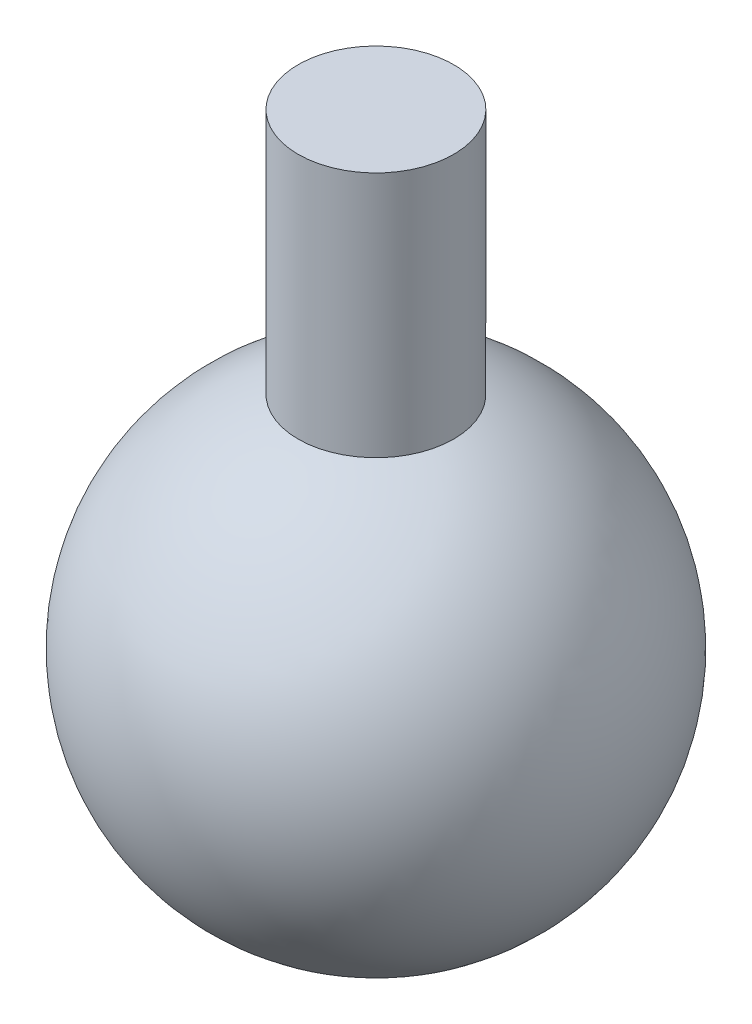
ISO-10303-21;
HEADER;
FILE_DESCRIPTION(('STEP AP214'),'2;1');
FILE_NAME('part.step','',(''),(''),'','','');
FILE_SCHEMA(('AUTOMOTIVE_DESIGN { 1 0 10303 214 1 1 1 1 }'));
ENDSEC;
DATA;
#1=APPLICATION_CONTEXT('core data for automotive mechanical design processes');
#2=APPLICATION_PROTOCOL_DEFINITION('international standard','automotive_design',2000,#1);
#3=PRODUCT_CONTEXT('',#1,'mechanical');
#4=PRODUCT('Part','Part','',(#3));
#5=PRODUCT_RELATED_PRODUCT_CATEGORY('part','',(#4));
#6=PRODUCT_DEFINITION_FORMATION('','',#4);
#7=PRODUCT_DEFINITION_CONTEXT('part definition',#1,'design');
#8=PRODUCT_DEFINITION('design','',#6,#7);
#9=PRODUCT_DEFINITION_SHAPE('','',#8);
#10=(LENGTH_UNIT() NAMED_UNIT(*) SI_UNIT(.MILLI.,.METRE.));
#11=(NAMED_UNIT(*) PLANE_ANGLE_UNIT() SI_UNIT($,.RADIAN.));
#12=(NAMED_UNIT(*) SI_UNIT($,.STERADIAN.) SOLID_ANGLE_UNIT());
#13=UNCERTAINTY_MEASURE_WITH_UNIT(LENGTH_MEASURE(1.E-05),#10,'distance_accuracy_value','');
#14=(GEOMETRIC_REPRESENTATION_CONTEXT(3) GLOBAL_UNCERTAINTY_ASSIGNED_CONTEXT((#13)) GLOBAL_UNIT_ASSIGNED_CONTEXT((#10,
#11,#12)) REPRESENTATION_CONTEXT('',''));
#15=CARTESIAN_POINT('',(0.,0.,0.));
#16=DIRECTION('',(0.,0.,1.));
#17=DIRECTION('',(1.,0.,0.));
#18=AXIS2_PLACEMENT_3D('',#15,#16,#17);
#19=CARTESIAN_POINT('',(0.,65.,0.));
#20=DIRECTION('',(0.,1.,0.));
#21=DIRECTION('',(0.,0.,1.));
#22=AXIS2_PLACEMENT_3D('',#19,#20,#21);
#23=CYLINDRICAL_SURFACE('',#22,25.);
#24=CARTESIAN_POINT('',(0.,150.,0.));
#25=DIRECTION('',(0.,1.,0.));
#26=DIRECTION('',(0.,0.,1.));
#27=AXIS2_PLACEMENT_3D('',#24,#25,#26);
#28=CIRCLE('',#27,25.);
#29=CARTESIAN_POINT('',(0.,150.,25.));
#30=VERTEX_POINT('',#29);
#31=EDGE_CURVE('E49',#30,#30,#28,.T.);
#32=ORIENTED_EDGE('',*,*,#31,.F.);
#33=EDGE_LOOP('',(#32));
#34=FACE_BOUND('',#33,.T.);
#35=CARTESIAN_POINT('',(0.,70.7106781186548,0.));
#36=DIRECTION('',(0.,-1.,0.));
#37=DIRECTION('',(0.,0.,-1.));
#38=AXIS2_PLACEMENT_3D('',#35,#36,#37);
#39=CIRCLE('',#38,25.);
#40=CARTESIAN_POINT('',(0.,70.7106781186548,-25.));
#41=VERTEX_POINT('',#40);
#42=EDGE_CURVE('E10',#41,#41,#39,.T.);
#43=ORIENTED_EDGE('',*,*,#42,.F.);
#44=EDGE_LOOP('',(#43));
#45=FACE_BOUND('',#44,.T.);
#46=ADVANCED_FACE('F41',(#34,#45),#23,.T.);
#47=CARTESIAN_POINT('',(0.,150.,0.));
#48=DIRECTION('',(0.,1.,0.));
#49=DIRECTION('',(0.,0.,1.));
#50=AXIS2_PLACEMENT_3D('',#47,#48,#49);
#51=PLANE('',#50);
#52=ORIENTED_EDGE('',*,*,#31,.T.);
#53=EDGE_LOOP('',(#52));
#54=FACE_BOUND('',#53,.T.);
#55=ADVANCED_FACE('F56',(#54),#51,.T.);
#56=CARTESIAN_POINT('',(0.,0.,0.));
#57=DIRECTION('',(0.,1.,0.));
#58=DIRECTION('',(1.,0.,0.));
#59=AXIS2_PLACEMENT_3D('',#56,#57,#58);
#60=SPHERICAL_SURFACE('',#59,75.);
#61=ORIENTED_EDGE('',*,*,#42,.T.);
#62=EDGE_LOOP('',(#61));
#63=FACE_BOUND('',#62,.T.);
#64=ADVANCED_FACE('F43',(#63),#60,.T.);
#65=CLOSED_SHELL('',(#46,#55,#64));
#66=MANIFOLD_SOLID_BREP('B2',#65);
#67=ADVANCED_BREP_SHAPE_REPRESENTATION('',(#18,#66),#14);
#68=SHAPE_DEFINITION_REPRESENTATION(#9,#67);
ENDSEC;
END-ISO-10303-21;
